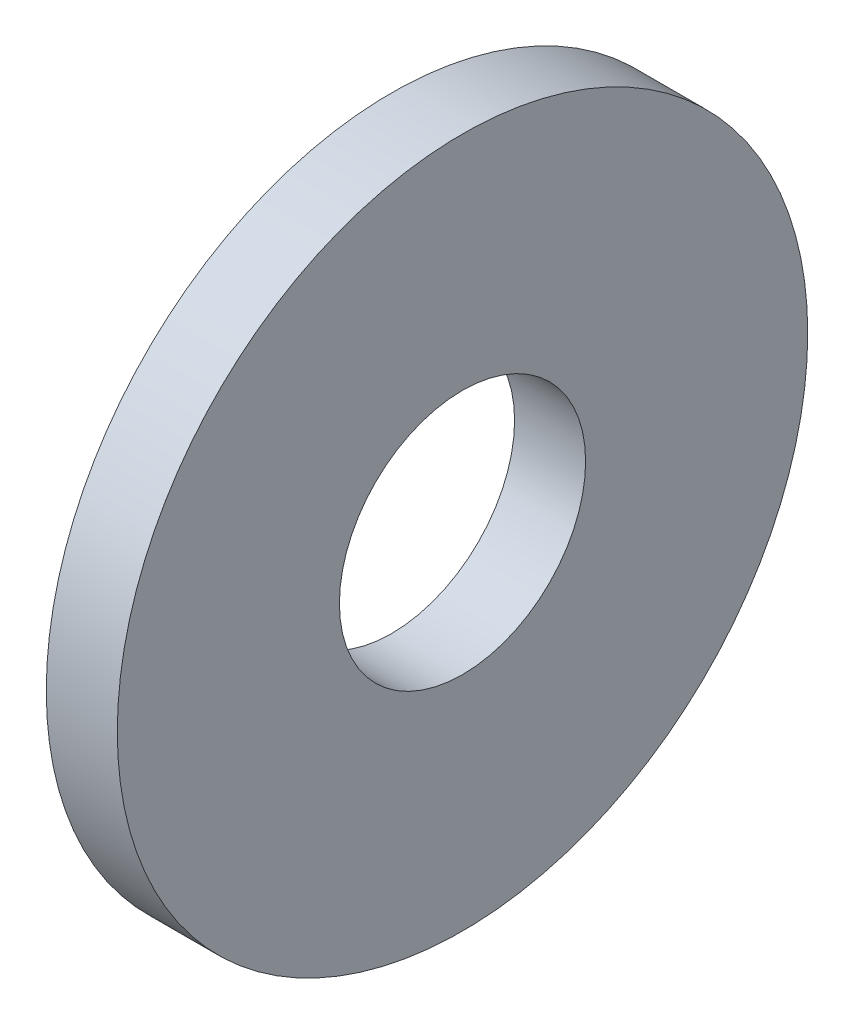
ISO-10303-21;
HEADER;
FILE_DESCRIPTION(('STEP AP214'),'2;1');
FILE_NAME('part.step','',(''),(''),'','','');
FILE_SCHEMA(('AUTOMOTIVE_DESIGN { 1 0 10303 214 1 1 1 1 }'));
ENDSEC;
DATA;
#1=APPLICATION_CONTEXT('core data for automotive mechanical design processes');
#2=APPLICATION_PROTOCOL_DEFINITION('international standard','automotive_design',2000,#1);
#3=PRODUCT_CONTEXT('',#1,'mechanical');
#4=PRODUCT('Part','Part','',(#3));
#5=PRODUCT_RELATED_PRODUCT_CATEGORY('part','',(#4));
#6=PRODUCT_DEFINITION_FORMATION('','',#4);
#7=PRODUCT_DEFINITION_CONTEXT('part definition',#1,'design');
#8=PRODUCT_DEFINITION('design','',#6,#7);
#9=PRODUCT_DEFINITION_SHAPE('','',#8);
#10=(LENGTH_UNIT() NAMED_UNIT(*) SI_UNIT(.MILLI.,.METRE.));
#11=(NAMED_UNIT(*) PLANE_ANGLE_UNIT() SI_UNIT($,.RADIAN.));
#12=(NAMED_UNIT(*) SI_UNIT($,.STERADIAN.) SOLID_ANGLE_UNIT());
#13=UNCERTAINTY_MEASURE_WITH_UNIT(LENGTH_MEASURE(1.E-05),#10,'distance_accuracy_value','');
#14=(GEOMETRIC_REPRESENTATION_CONTEXT(3) GLOBAL_UNCERTAINTY_ASSIGNED_CONTEXT((#13)) GLOBAL_UNIT_ASSIGNED_CONTEXT((#10,
#11,#12)) REPRESENTATION_CONTEXT('',''));
#15=CARTESIAN_POINT('',(0.,0.,0.));
#16=DIRECTION('',(0.,0.,1.));
#17=DIRECTION('',(1.,0.,0.));
#18=AXIS2_PLACEMENT_3D('',#15,#16,#17);
#19=CARTESIAN_POINT('',(1.143,0.,0.));
#20=DIRECTION('',(1.,0.,0.));
#21=DIRECTION('',(0.,0.,-1.));
#22=AXIS2_PLACEMENT_3D('',#19,#20,#21);
#23=PLANE('',#22);
#24=CARTESIAN_POINT('',(1.143,0.,0.));
#25=DIRECTION('',(1.,0.,0.));
#26=DIRECTION('',(0.,0.,-1.));
#27=AXIS2_PLACEMENT_3D('',#24,#25,#26);
#28=CIRCLE('',#27,5.55625);
#29=CARTESIAN_POINT('',(1.143,0.,-5.55625));
#30=VERTEX_POINT('',#29);
#31=EDGE_CURVE('E10',#30,#30,#28,.T.);
#32=ORIENTED_EDGE('',*,*,#31,.T.);
#33=EDGE_LOOP('',(#32));
#34=FACE_BOUND('',#33,.T.);
#35=CARTESIAN_POINT('',(1.143,0.,0.));
#36=DIRECTION('',(1.,0.,0.));
#37=DIRECTION('',(0.,0.,-1.));
#38=AXIS2_PLACEMENT_3D('',#35,#36,#37);
#39=CIRCLE('',#38,1.9812);
#40=CARTESIAN_POINT('',(1.143,0.,-1.9812));
#41=VERTEX_POINT('',#40);
#42=EDGE_CURVE('E45',#41,#41,#39,.T.);
#43=ORIENTED_EDGE('',*,*,#42,.F.);
#44=EDGE_LOOP('',(#43));
#45=FACE_BOUND('',#44,.T.);
#46=ADVANCED_FACE('F34',(#34,#45),#23,.T.);
#47=CARTESIAN_POINT('',(0.,0.,0.));
#48=DIRECTION('',(1.,0.,0.));
#49=DIRECTION('',(0.,0.,-1.));
#50=AXIS2_PLACEMENT_3D('',#47,#48,#49);
#51=PLANE('',#50);
#52=CARTESIAN_POINT('',(0.,0.,0.));
#53=DIRECTION('',(1.,0.,0.));
#54=DIRECTION('',(0.,0.,-1.));
#55=AXIS2_PLACEMENT_3D('',#52,#53,#54);
#56=CIRCLE('',#55,5.55625);
#57=CARTESIAN_POINT('',(0.,0.,-5.55625));
#58=VERTEX_POINT('',#57);
#59=EDGE_CURVE('E38',#58,#58,#56,.T.);
#60=ORIENTED_EDGE('',*,*,#59,.F.);
#61=EDGE_LOOP('',(#60));
#62=FACE_BOUND('',#61,.T.);
#63=CARTESIAN_POINT('',(0.,0.,0.));
#64=DIRECTION('',(1.,0.,0.));
#65=DIRECTION('',(0.,0.,-1.));
#66=AXIS2_PLACEMENT_3D('',#63,#64,#65);
#67=CIRCLE('',#66,1.9812);
#68=CARTESIAN_POINT('',(0.,0.,-1.9812));
#69=VERTEX_POINT('',#68);
#70=EDGE_CURVE('E47',#69,#69,#67,.T.);
#71=ORIENTED_EDGE('',*,*,#70,.T.);
#72=EDGE_LOOP('',(#71));
#73=FACE_BOUND('',#72,.T.);
#74=ADVANCED_FACE('F57',(#62,#73),#51,.F.);
#75=CARTESIAN_POINT('',(1.143,0.,0.));
#76=DIRECTION('',(-1.,0.,0.));
#77=DIRECTION('',(0.,0.,1.));
#78=AXIS2_PLACEMENT_3D('',#75,#76,#77);
#79=CYLINDRICAL_SURFACE('',#78,5.55625);
#80=ORIENTED_EDGE('',*,*,#31,.F.);
#81=EDGE_LOOP('',(#80));
#82=FACE_BOUND('',#81,.T.);
#83=ORIENTED_EDGE('',*,*,#59,.T.);
#84=EDGE_LOOP('',(#83));
#85=FACE_BOUND('',#84,.T.);
#86=ADVANCED_FACE('F36',(#82,#85),#79,.T.);
#87=CARTESIAN_POINT('',(1.143,0.,0.));
#88=DIRECTION('',(-1.,0.,0.));
#89=DIRECTION('',(0.,0.,1.));
#90=AXIS2_PLACEMENT_3D('',#87,#88,#89);
#91=CYLINDRICAL_SURFACE('',#90,1.9812);
#92=ORIENTED_EDGE('',*,*,#42,.T.);
#93=EDGE_LOOP('',(#92));
#94=FACE_BOUND('',#93,.T.);
#95=ORIENTED_EDGE('',*,*,#70,.F.);
#96=EDGE_LOOP('',(#95));
#97=FACE_BOUND('',#96,.T.);
#98=ADVANCED_FACE('F53',(#94,#97),#91,.F.);
#99=CLOSED_SHELL('',(#46,#74,#86,#98));
#100=MANIFOLD_SOLID_BREP('B2',#99);
#101=ADVANCED_BREP_SHAPE_REPRESENTATION('',(#18,#100),#14);
#102=SHAPE_DEFINITION_REPRESENTATION(#9,#101);
ENDSEC;
END-ISO-10303-21;
